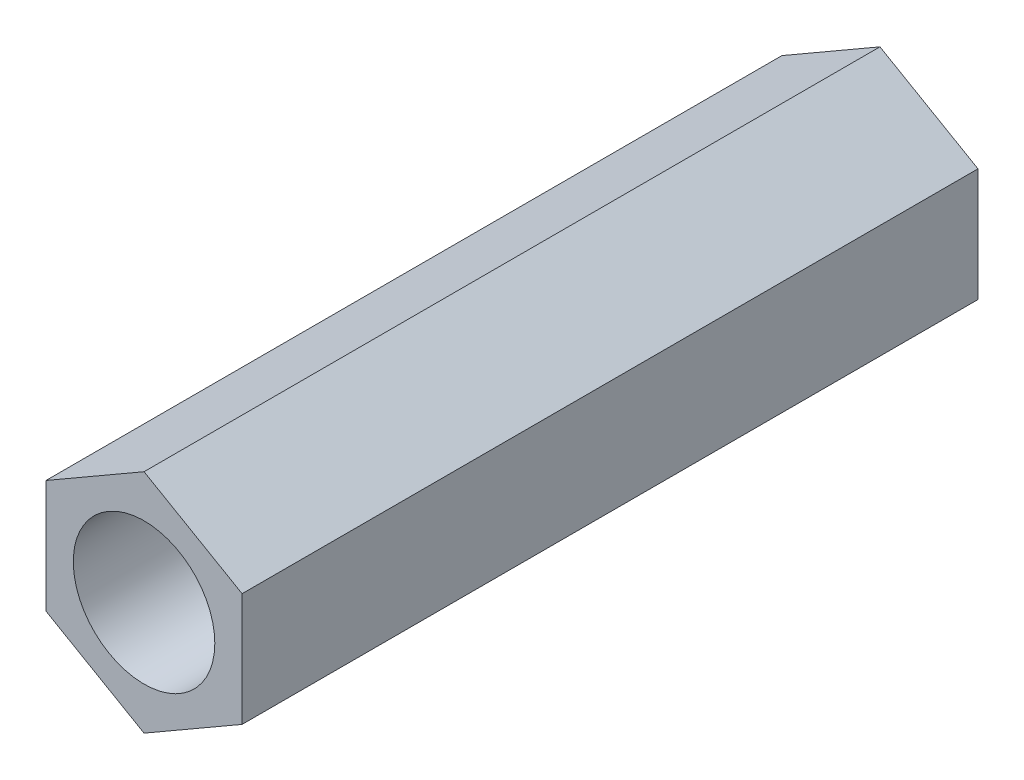
ISO-10303-21;
HEADER;
FILE_DESCRIPTION(('STEP AP214'),'2;1');
FILE_NAME('part.step','',(''),(''),'','','');
FILE_SCHEMA(('AUTOMOTIVE_DESIGN { 1 0 10303 214 1 1 1 1 }'));
ENDSEC;
DATA;
#1=APPLICATION_CONTEXT('core data for automotive mechanical design processes');
#2=APPLICATION_PROTOCOL_DEFINITION('international standard','automotive_design',2000,#1);
#3=PRODUCT_CONTEXT('',#1,'mechanical');
#4=PRODUCT('Part','Part','',(#3));
#5=PRODUCT_RELATED_PRODUCT_CATEGORY('part','',(#4));
#6=PRODUCT_DEFINITION_FORMATION('','',#4);
#7=PRODUCT_DEFINITION_CONTEXT('part definition',#1,'design');
#8=PRODUCT_DEFINITION('design','',#6,#7);
#9=PRODUCT_DEFINITION_SHAPE('','',#8);
#10=(LENGTH_UNIT() NAMED_UNIT(*) SI_UNIT(.MILLI.,.METRE.));
#11=(NAMED_UNIT(*) PLANE_ANGLE_UNIT() SI_UNIT($,.RADIAN.));
#12=(NAMED_UNIT(*) SI_UNIT($,.STERADIAN.) SOLID_ANGLE_UNIT());
#13=UNCERTAINTY_MEASURE_WITH_UNIT(LENGTH_MEASURE(1.E-05),#10,'distance_accuracy_value','');
#14=(GEOMETRIC_REPRESENTATION_CONTEXT(3) GLOBAL_UNCERTAINTY_ASSIGNED_CONTEXT((#13)) GLOBAL_UNIT_ASSIGNED_CONTEXT((#10,
#11,#12)) REPRESENTATION_CONTEXT('',''));
#15=CARTESIAN_POINT('',(0.,0.,0.));
#16=DIRECTION('',(0.,0.,1.));
#17=DIRECTION('',(1.,0.,0.));
#18=AXIS2_PLACEMENT_3D('',#15,#16,#17);
#19=CARTESIAN_POINT('',(0.,0.,660.4));
#20=DIRECTION('',(0.,0.,1.));
#21=DIRECTION('',(1.,0.,0.));
#22=AXIS2_PLACEMENT_3D('',#19,#20,#21);
#23=PLANE('',#22);
#24=DIRECTION('',(-0.86602540378444,-0.499999999999997,0.));
#25=VECTOR('',#24,1.);
#26=CARTESIAN_POINT('',(0.,101.6,660.4));
#27=LINE('',#26,#25);
#28=CARTESIAN_POINT('',(0.,101.6,660.4));
#29=VERTEX_POINT('',#28);
#30=CARTESIAN_POINT('',(-87.9881810244991,50.8,660.4));
#31=VERTEX_POINT('',#30);
#32=EDGE_CURVE('E129',#29,#31,#27,.T.);
#33=ORIENTED_EDGE('',*,*,#32,.T.);
#34=DIRECTION('',(0.,-1.,0.));
#35=VECTOR('',#34,1.);
#36=CARTESIAN_POINT('',(-87.9881810244991,50.8,660.4));
#37=LINE('',#36,#35);
#38=CARTESIAN_POINT('',(-87.9881810244991,-50.7999999999999,660.4));
#39=VERTEX_POINT('',#38);
#40=EDGE_CURVE('E87',#31,#39,#37,.T.);
#41=ORIENTED_EDGE('',*,*,#40,.T.);
#42=DIRECTION('',(0.866025403784439,-0.499999999999999,0.));
#43=VECTOR('',#42,1.);
#44=CARTESIAN_POINT('',(-87.9881810244991,-50.7999999999999,660.4));
#45=LINE('',#44,#43);
#46=CARTESIAN_POINT('',(0.,-101.6,660.4));
#47=VERTEX_POINT('',#46);
#48=EDGE_CURVE('E100',#39,#47,#45,.T.);
#49=ORIENTED_EDGE('',*,*,#48,.T.);
#50=DIRECTION('',(0.86602540378444,0.499999999999998,0.));
#51=VECTOR('',#50,1.);
#52=CARTESIAN_POINT('',(87.9881810244991,-50.8,660.4));
#53=LINE('',#52,#51);
#54=CARTESIAN_POINT('',(87.9881810244991,-50.8,660.4));
#55=VERTEX_POINT('',#54);
#56=EDGE_CURVE('E94',#47,#55,#53,.T.);
#57=ORIENTED_EDGE('',*,*,#56,.T.);
#58=DIRECTION('',(0.,1.,0.));
#59=VECTOR('',#58,1.);
#60=CARTESIAN_POINT('',(87.9881810244991,50.8,660.4));
#61=LINE('',#60,#59);
#62=CARTESIAN_POINT('',(87.9881810244991,50.8,660.4));
#63=VERTEX_POINT('',#62);
#64=EDGE_CURVE('E98',#55,#63,#61,.T.);
#65=ORIENTED_EDGE('',*,*,#64,.T.);
#66=DIRECTION('',(-0.86602540378444,0.499999999999998,0.));
#67=VECTOR('',#66,1.);
#68=CARTESIAN_POINT('',(0.,101.6,660.4));
#69=LINE('',#68,#67);
#70=EDGE_CURVE('E50',#63,#29,#69,.T.);
#71=ORIENTED_EDGE('',*,*,#70,.T.);
#72=EDGE_LOOP('',(#33,#41,#49,#57,#65,#71));
#73=FACE_BOUND('',#72,.T.);
#74=CARTESIAN_POINT('',(0.,0.,660.4));
#75=DIRECTION('',(0.,0.,1.));
#76=DIRECTION('',(1.,0.,0.));
#77=AXIS2_PLACEMENT_3D('',#74,#75,#76);
#78=CIRCLE('',#77,63.5);
#79=CARTESIAN_POINT('',(63.5,0.,660.4));
#80=VERTEX_POINT('',#79);
#81=EDGE_CURVE('E122',#80,#80,#78,.T.);
#82=ORIENTED_EDGE('',*,*,#81,.F.);
#83=EDGE_LOOP('',(#82));
#84=FACE_BOUND('',#83,.T.);
#85=ADVANCED_FACE('F33',(#73,#84),#23,.T.);
#86=CARTESIAN_POINT('',(0.,0.,0.));
#87=DIRECTION('',(0.,0.,1.));
#88=DIRECTION('',(1.,0.,0.));
#89=AXIS2_PLACEMENT_3D('',#86,#87,#88);
#90=PLANE('',#89);
#91=DIRECTION('',(-0.86602540378444,-0.499999999999997,0.));
#92=VECTOR('',#91,1.);
#93=CARTESIAN_POINT('',(0.,101.6,0.));
#94=LINE('',#93,#92);
#95=CARTESIAN_POINT('',(0.,101.6,0.));
#96=VERTEX_POINT('',#95);
#97=CARTESIAN_POINT('',(-87.9881810244991,50.8,0.));
#98=VERTEX_POINT('',#97);
#99=EDGE_CURVE('E118',#96,#98,#94,.T.);
#100=ORIENTED_EDGE('',*,*,#99,.F.);
#101=DIRECTION('',(-0.86602540378444,0.499999999999998,0.));
#102=VECTOR('',#101,1.);
#103=CARTESIAN_POINT('',(0.,101.6,0.));
#104=LINE('',#103,#102);
#105=CARTESIAN_POINT('',(87.9881810244991,50.8,0.));
#106=VERTEX_POINT('',#105);
#107=EDGE_CURVE('E79',#106,#96,#104,.T.);
#108=ORIENTED_EDGE('',*,*,#107,.F.);
#109=DIRECTION('',(0.,1.,0.));
#110=VECTOR('',#109,1.);
#111=CARTESIAN_POINT('',(87.9881810244991,50.8,0.));
#112=LINE('',#111,#110);
#113=CARTESIAN_POINT('',(87.9881810244991,-50.8,0.));
#114=VERTEX_POINT('',#113);
#115=EDGE_CURVE('E73',#114,#106,#112,.T.);
#116=ORIENTED_EDGE('',*,*,#115,.F.);
#117=DIRECTION('',(0.86602540378444,0.499999999999998,0.));
#118=VECTOR('',#117,1.);
#119=CARTESIAN_POINT('',(87.9881810244991,-50.8,0.));
#120=LINE('',#119,#118);
#121=CARTESIAN_POINT('',(0.,-101.6,0.));
#122=VERTEX_POINT('',#121);
#123=EDGE_CURVE('E108',#122,#114,#120,.T.);
#124=ORIENTED_EDGE('',*,*,#123,.F.);
#125=DIRECTION('',(0.866025403784439,-0.499999999999999,0.));
#126=VECTOR('',#125,1.);
#127=CARTESIAN_POINT('',(-87.9881810244991,-50.7999999999999,0.));
#128=LINE('',#127,#126);
#129=CARTESIAN_POINT('',(-87.9881810244991,-50.7999999999999,0.));
#130=VERTEX_POINT('',#129);
#131=EDGE_CURVE('E124',#130,#122,#128,.T.);
#132=ORIENTED_EDGE('',*,*,#131,.F.);
#133=DIRECTION('',(0.,-1.,0.));
#134=VECTOR('',#133,1.);
#135=CARTESIAN_POINT('',(-87.9881810244991,50.8,0.));
#136=LINE('',#135,#134);
#137=EDGE_CURVE('E121',#98,#130,#136,.T.);
#138=ORIENTED_EDGE('',*,*,#137,.F.);
#139=EDGE_LOOP('',(#100,#108,#116,#124,#132,#138));
#140=FACE_BOUND('',#139,.T.);
#141=CARTESIAN_POINT('',(0.,0.,0.));
#142=DIRECTION('',(0.,0.,1.));
#143=DIRECTION('',(1.,0.,0.));
#144=AXIS2_PLACEMENT_3D('',#141,#142,#143);
#145=CIRCLE('',#144,63.5);
#146=CARTESIAN_POINT('',(63.5,0.,0.));
#147=VERTEX_POINT('',#146);
#148=EDGE_CURVE('E222',#147,#147,#145,.T.);
#149=ORIENTED_EDGE('',*,*,#148,.T.);
#150=EDGE_LOOP('',(#149));
#151=FACE_BOUND('',#150,.T.);
#152=ADVANCED_FACE('F138',(#140,#151),#90,.F.);
#153=CARTESIAN_POINT('',(0.,101.6,660.4));
#154=DIRECTION('',(0.499999999999997,-0.86602540378444,0.));
#155=DIRECTION('',(0.86602540378444,0.499999999999997,0.));
#156=AXIS2_PLACEMENT_3D('',#153,#154,#155);
#157=PLANE('',#156);
#158=ORIENTED_EDGE('',*,*,#99,.T.);
#159=DIRECTION('',(0.,0.,-1.));
#160=VECTOR('',#159,1.);
#161=CARTESIAN_POINT('',(-87.9881810244991,50.8,660.4));
#162=LINE('',#161,#160);
#163=EDGE_CURVE('E11',#31,#98,#162,.T.);
#164=ORIENTED_EDGE('',*,*,#163,.F.);
#165=ORIENTED_EDGE('',*,*,#32,.F.);
#166=DIRECTION('',(0.,0.,-1.));
#167=VECTOR('',#166,1.);
#168=CARTESIAN_POINT('',(0.,101.6,660.4));
#169=LINE('',#168,#167);
#170=EDGE_CURVE('E114',#29,#96,#169,.T.);
#171=ORIENTED_EDGE('',*,*,#170,.T.);
#172=EDGE_LOOP('',(#158,#164,#165,#171));
#173=FACE_BOUND('',#172,.T.);
#174=ADVANCED_FACE('F35',(#173),#157,.F.);
#175=CARTESIAN_POINT('',(-87.9881810244991,50.8,660.4));
#176=DIRECTION('',(1.,0.,0.));
#177=DIRECTION('',(0.,1.,0.));
#178=AXIS2_PLACEMENT_3D('',#175,#176,#177);
#179=PLANE('',#178);
#180=ORIENTED_EDGE('',*,*,#137,.T.);
#181=DIRECTION('',(0.,0.,-1.));
#182=VECTOR('',#181,1.);
#183=CARTESIAN_POINT('',(-87.9881810244991,-50.7999999999999,660.4));
#184=LINE('',#183,#182);
#185=EDGE_CURVE('E42',#39,#130,#184,.T.);
#186=ORIENTED_EDGE('',*,*,#185,.F.);
#187=ORIENTED_EDGE('',*,*,#40,.F.);
#188=ORIENTED_EDGE('',*,*,#163,.T.);
#189=EDGE_LOOP('',(#180,#186,#187,#188));
#190=FACE_BOUND('',#189,.T.);
#191=ADVANCED_FACE('F163',(#190),#179,.F.);
#192=CARTESIAN_POINT('',(-87.9881810244991,-50.7999999999999,660.4));
#193=DIRECTION('',(0.499999999999999,0.866025403784439,0.));
#194=DIRECTION('',(-0.866025403784439,0.499999999999999,0.));
#195=AXIS2_PLACEMENT_3D('',#192,#193,#194);
#196=PLANE('',#195);
#197=ORIENTED_EDGE('',*,*,#131,.T.);
#198=DIRECTION('',(0.,0.,-1.));
#199=VECTOR('',#198,1.);
#200=CARTESIAN_POINT('',(0.,-101.6,660.4));
#201=LINE('',#200,#199);
#202=EDGE_CURVE('E109',#47,#122,#201,.T.);
#203=ORIENTED_EDGE('',*,*,#202,.F.);
#204=ORIENTED_EDGE('',*,*,#48,.F.);
#205=ORIENTED_EDGE('',*,*,#185,.T.);
#206=EDGE_LOOP('',(#197,#203,#204,#205));
#207=FACE_BOUND('',#206,.T.);
#208=ADVANCED_FACE('F135',(#207),#196,.F.);
#209=CARTESIAN_POINT('',(87.9881810244991,-50.8,660.4));
#210=DIRECTION('',(-0.499999999999998,0.86602540378444,0.));
#211=DIRECTION('',(-0.86602540378444,-0.499999999999998,0.));
#212=AXIS2_PLACEMENT_3D('',#209,#210,#211);
#213=PLANE('',#212);
#214=ORIENTED_EDGE('',*,*,#123,.T.);
#215=DIRECTION('',(0.,0.,-1.));
#216=VECTOR('',#215,1.);
#217=CARTESIAN_POINT('',(87.9881810244991,-50.8,660.4));
#218=LINE('',#217,#216);
#219=EDGE_CURVE('E105',#55,#114,#218,.T.);
#220=ORIENTED_EDGE('',*,*,#219,.F.);
#221=ORIENTED_EDGE('',*,*,#56,.F.);
#222=ORIENTED_EDGE('',*,*,#202,.T.);
#223=EDGE_LOOP('',(#214,#220,#221,#222));
#224=FACE_BOUND('',#223,.T.);
#225=ADVANCED_FACE('F106',(#224),#213,.F.);
#226=CARTESIAN_POINT('',(87.9881810244991,50.8,660.4));
#227=DIRECTION('',(-1.,0.,0.));
#228=DIRECTION('',(0.,-1.,0.));
#229=AXIS2_PLACEMENT_3D('',#226,#227,#228);
#230=PLANE('',#229);
#231=ORIENTED_EDGE('',*,*,#115,.T.);
#232=DIRECTION('',(0.,0.,-1.));
#233=VECTOR('',#232,1.);
#234=CARTESIAN_POINT('',(87.9881810244991,50.8,660.4));
#235=LINE('',#234,#233);
#236=EDGE_CURVE('E110',#63,#106,#235,.T.);
#237=ORIENTED_EDGE('',*,*,#236,.F.);
#238=ORIENTED_EDGE('',*,*,#64,.F.);
#239=ORIENTED_EDGE('',*,*,#219,.T.);
#240=EDGE_LOOP('',(#231,#237,#238,#239));
#241=FACE_BOUND('',#240,.T.);
#242=ADVANCED_FACE('F112',(#241),#230,.F.);
#243=CARTESIAN_POINT('',(0.,101.6,660.4));
#244=DIRECTION('',(-0.499999999999998,-0.86602540378444,0.));
#245=DIRECTION('',(0.86602540378444,-0.499999999999998,0.));
#246=AXIS2_PLACEMENT_3D('',#243,#244,#245);
#247=PLANE('',#246);
#248=ORIENTED_EDGE('',*,*,#107,.T.);
#249=ORIENTED_EDGE('',*,*,#170,.F.);
#250=ORIENTED_EDGE('',*,*,#70,.F.);
#251=ORIENTED_EDGE('',*,*,#236,.T.);
#252=EDGE_LOOP('',(#248,#249,#250,#251));
#253=FACE_BOUND('',#252,.T.);
#254=ADVANCED_FACE('F143',(#253),#247,.F.);
#255=CARTESIAN_POINT('',(0.,0.,660.4));
#256=DIRECTION('',(0.,0.,-1.));
#257=DIRECTION('',(-1.,0.,0.));
#258=AXIS2_PLACEMENT_3D('',#255,#256,#257);
#259=CYLINDRICAL_SURFACE('',#258,63.5);
#260=ORIENTED_EDGE('',*,*,#81,.T.);
#261=EDGE_LOOP('',(#260));
#262=FACE_BOUND('',#261,.T.);
#263=ORIENTED_EDGE('',*,*,#148,.F.);
#264=EDGE_LOOP('',(#263));
#265=FACE_BOUND('',#264,.T.);
#266=ADVANCED_FACE('F145',(#262,#265),#259,.F.);
#267=CLOSED_SHELL('',(#85,#152,#174,#191,#208,#225,#242,#254,#266));
#268=MANIFOLD_SOLID_BREP('B2',#267);
#269=ADVANCED_BREP_SHAPE_REPRESENTATION('',(#18,#268),#14);
#270=SHAPE_DEFINITION_REPRESENTATION(#9,#269);
ENDSEC;
END-ISO-10303-21;
